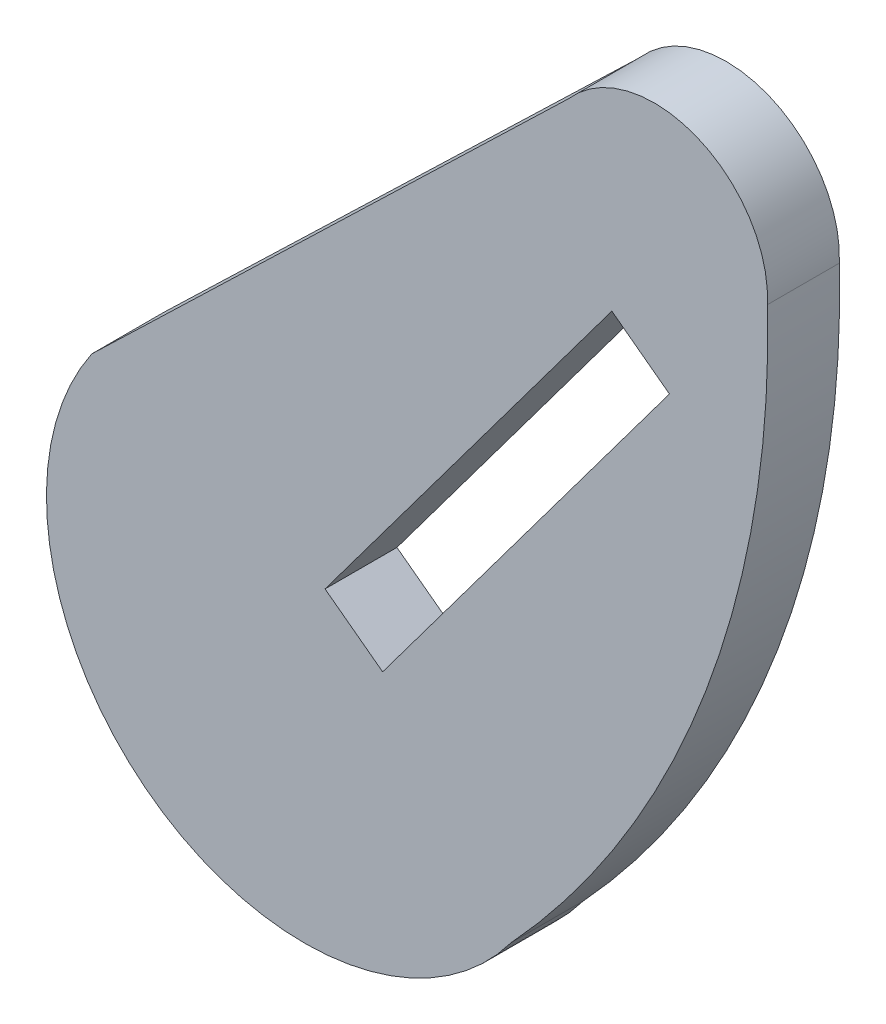
ISO-10303-21;
HEADER;
FILE_DESCRIPTION(('STEP AP214'),'2;1');
FILE_NAME('part.step','',(''),(''),'','','');
FILE_SCHEMA(('AUTOMOTIVE_DESIGN { 1 0 10303 214 1 1 1 1 }'));
ENDSEC;
DATA;
#1=APPLICATION_CONTEXT('core data for automotive mechanical design processes');
#2=APPLICATION_PROTOCOL_DEFINITION('international standard','automotive_design',2000,#1);
#3=PRODUCT_CONTEXT('',#1,'mechanical');
#4=PRODUCT('Part','Part','',(#3));
#5=PRODUCT_RELATED_PRODUCT_CATEGORY('part','',(#4));
#6=PRODUCT_DEFINITION_FORMATION('','',#4);
#7=PRODUCT_DEFINITION_CONTEXT('part definition',#1,'design');
#8=PRODUCT_DEFINITION('design','',#6,#7);
#9=PRODUCT_DEFINITION_SHAPE('','',#8);
#10=(LENGTH_UNIT() NAMED_UNIT(*) SI_UNIT(.MILLI.,.METRE.));
#11=(NAMED_UNIT(*) PLANE_ANGLE_UNIT() SI_UNIT($,.RADIAN.));
#12=(NAMED_UNIT(*) SI_UNIT($,.STERADIAN.) SOLID_ANGLE_UNIT());
#13=UNCERTAINTY_MEASURE_WITH_UNIT(LENGTH_MEASURE(1.E-05),#10,'distance_accuracy_value','');
#14=(GEOMETRIC_REPRESENTATION_CONTEXT(3) GLOBAL_UNCERTAINTY_ASSIGNED_CONTEXT((#13)) GLOBAL_UNIT_ASSIGNED_CONTEXT((#10,
#11,#12)) REPRESENTATION_CONTEXT('',''));
#15=CARTESIAN_POINT('',(0.,0.,0.));
#16=DIRECTION('',(0.,0.,1.));
#17=DIRECTION('',(1.,0.,0.));
#18=AXIS2_PLACEMENT_3D('',#15,#16,#17);
#19=CARTESIAN_POINT('',(-800.658033872501,-117.32718023379,3.));
#20=DIRECTION('',(0.,0.,1.));
#21=DIRECTION('',(1.,0.,0.));
#22=AXIS2_PLACEMENT_3D('',#19,#20,#21);
#23=PLANE('',#22);
#24=CARTESIAN_POINT('',(-800.658033872501,-117.32718023379,3.));
#25=DIRECTION('',(0.,0.,1.));
#26=DIRECTION('',(1.,0.,0.));
#27=AXIS2_PLACEMENT_3D('',#24,#25,#26);
#28=CIRCLE('',#27,10.7666614434912);
#29=CARTESIAN_POINT('',(-809.531671810658,-111.229676778992,3.));
#30=VERTEX_POINT('',#29);
#31=CARTESIAN_POINT('',(-792.031629072118,-123.769706047373,3.));
#32=VERTEX_POINT('',#31);
#33=EDGE_CURVE('E141',#30,#32,#28,.T.);
#34=ORIENTED_EDGE('',*,*,#33,.T.);
#35=CARTESIAN_POINT('',(-821.645619087199,-96.3880376426148,3.));
#36=DIRECTION('',(0.,0.,1.));
#37=DIRECTION('',(1.,0.,0.));
#38=AXIS2_PLACEMENT_3D('',#35,#36,#37);
#39=CIRCLE('',#38,40.3329166964334);
#40=CARTESIAN_POINT('',(-781.326120483584,-95.347748454672,3.));
#41=VERTEX_POINT('',#40);
#42=EDGE_CURVE('E144',#32,#41,#39,.T.);
#43=ORIENTED_EDGE('',*,*,#42,.T.);
#44=CARTESIAN_POINT('',(-786.047877368588,-95.1410879811995,3.));
#45=DIRECTION('',(0.,0.,1.));
#46=DIRECTION('',(1.,0.,0.));
#47=AXIS2_PLACEMENT_3D('',#44,#45,#46);
#48=CIRCLE('',#47,4.72627724878407);
#49=CARTESIAN_POINT('',(-789.614138010312,-92.0395590569968,3.));
#50=VERTEX_POINT('',#49);
#51=EDGE_CURVE('E146',#41,#50,#48,.T.);
#52=ORIENTED_EDGE('',*,*,#51,.T.);
#53=DIRECTION('',(-0.720134653279969,-0.693834332636645,0.));
#54=VECTOR('',#53,1.);
#55=CARTESIAN_POINT('',(-809.531671810658,-111.229676778992,3.));
#56=LINE('',#55,#54);
#57=EDGE_CURVE('E148',#50,#30,#56,.T.);
#58=ORIENTED_EDGE('',*,*,#57,.T.);
#59=EDGE_LOOP('',(#34,#43,#52,#58));
#60=FACE_BOUND('',#59,.T.);
#61=DIRECTION('',(0.598377300837112,0.801214456835929,0.));
#62=VECTOR('',#61,1.);
#63=CARTESIAN_POINT('',(-797.390770346987,-116.654380858265,3.));
#64=LINE('',#63,#62);
#65=CARTESIAN_POINT('',(-797.390770346987,-116.654380858265,3.));
#66=VERTEX_POINT('',#65);
#67=CARTESIAN_POINT('',(-785.418685199394,-100.624013922047,3.));
#68=VERTEX_POINT('',#67);
#69=EDGE_CURVE('E123',#66,#68,#64,.T.);
#70=ORIENTED_EDGE('',*,*,#69,.F.);
#71=DIRECTION('',(0.801214456835929,-0.598377300837112,0.));
#72=VECTOR('',#71,1.);
#73=CARTESIAN_POINT('',(-799.794413717495,-114.859248955753,3.));
#74=LINE('',#73,#72);
#75=CARTESIAN_POINT('',(-799.794413717495,-114.859248955753,3.));
#76=VERTEX_POINT('',#75);
#77=EDGE_CURVE('E112',#76,#66,#74,.T.);
#78=ORIENTED_EDGE('',*,*,#77,.F.);
#79=DIRECTION('',(-0.598377300837113,-0.801214456835928,0.));
#80=VECTOR('',#79,1.);
#81=CARTESIAN_POINT('',(-787.822328569902,-98.8288820195359,3.));
#82=LINE('',#81,#80);
#83=CARTESIAN_POINT('',(-787.822328569902,-98.8288820195359,3.));
#84=VERTEX_POINT('',#83);
#85=EDGE_CURVE('E127',#84,#76,#82,.T.);
#86=ORIENTED_EDGE('',*,*,#85,.F.);
#87=DIRECTION('',(-0.801214456835933,0.598377300837106,0.));
#88=VECTOR('',#87,1.);
#89=CARTESIAN_POINT('',(-785.418685199394,-100.624013922047,3.));
#90=LINE('',#89,#88);
#91=EDGE_CURVE('E125',#68,#84,#90,.T.);
#92=ORIENTED_EDGE('',*,*,#91,.F.);
#93=EDGE_LOOP('',(#70,#78,#86,#92));
#94=FACE_BOUND('',#93,.T.);
#95=ADVANCED_FACE('F32',(#60,#94),#23,.T.);
#96=CARTESIAN_POINT('',(-800.658033872501,-117.32718023379,0.));
#97=DIRECTION('',(0.,0.,1.));
#98=DIRECTION('',(1.,0.,0.));
#99=AXIS2_PLACEMENT_3D('',#96,#97,#98);
#100=PLANE('',#99);
#101=CARTESIAN_POINT('',(-800.658033872501,-117.32718023379,0.));
#102=DIRECTION('',(0.,0.,1.));
#103=DIRECTION('',(1.,0.,0.));
#104=AXIS2_PLACEMENT_3D('',#101,#102,#103);
#105=CIRCLE('',#104,10.7666614434912);
#106=CARTESIAN_POINT('',(-809.531671810658,-111.229676778992,0.));
#107=VERTEX_POINT('',#106);
#108=CARTESIAN_POINT('',(-792.031629072118,-123.769706047373,0.));
#109=VERTEX_POINT('',#108);
#110=EDGE_CURVE('E113',#107,#109,#105,.T.);
#111=ORIENTED_EDGE('',*,*,#110,.F.);
#112=DIRECTION('',(-0.720134653279969,-0.693834332636645,0.));
#113=VECTOR('',#112,1.);
#114=CARTESIAN_POINT('',(-809.531671810658,-111.229676778992,0.));
#115=LINE('',#114,#113);
#116=CARTESIAN_POINT('',(-789.614138010312,-92.0395590569968,0.));
#117=VERTEX_POINT('',#116);
#118=EDGE_CURVE('E139',#117,#107,#115,.T.);
#119=ORIENTED_EDGE('',*,*,#118,.F.);
#120=CARTESIAN_POINT('',(-786.047877368588,-95.1410879811995,0.));
#121=DIRECTION('',(0.,0.,1.));
#122=DIRECTION('',(1.,0.,0.));
#123=AXIS2_PLACEMENT_3D('',#120,#121,#122);
#124=CIRCLE('',#123,4.72627724878407);
#125=CARTESIAN_POINT('',(-781.326120483584,-95.347748454672,0.));
#126=VERTEX_POINT('',#125);
#127=EDGE_CURVE('E137',#126,#117,#124,.T.);
#128=ORIENTED_EDGE('',*,*,#127,.F.);
#129=CARTESIAN_POINT('',(-821.645619087199,-96.3880376426148,0.));
#130=DIRECTION('',(0.,0.,1.));
#131=DIRECTION('',(1.,0.,0.));
#132=AXIS2_PLACEMENT_3D('',#129,#130,#131);
#133=CIRCLE('',#132,40.3329166964334);
#134=EDGE_CURVE('E135',#109,#126,#133,.T.);
#135=ORIENTED_EDGE('',*,*,#134,.F.);
#136=EDGE_LOOP('',(#111,#119,#128,#135));
#137=FACE_BOUND('',#136,.T.);
#138=DIRECTION('',(0.801214456835929,-0.598377300837112,0.));
#139=VECTOR('',#138,1.);
#140=CARTESIAN_POINT('',(-799.794413717495,-114.859248955753,0.));
#141=LINE('',#140,#139);
#142=CARTESIAN_POINT('',(-799.794413717495,-114.859248955753,0.));
#143=VERTEX_POINT('',#142);
#144=CARTESIAN_POINT('',(-797.390770346987,-116.654380858265,0.));
#145=VERTEX_POINT('',#144);
#146=EDGE_CURVE('E55',#143,#145,#141,.T.);
#147=ORIENTED_EDGE('',*,*,#146,.T.);
#148=DIRECTION('',(0.598377300837112,0.801214456835929,0.));
#149=VECTOR('',#148,1.);
#150=CARTESIAN_POINT('',(-797.390770346987,-116.654380858265,0.));
#151=LINE('',#150,#149);
#152=CARTESIAN_POINT('',(-785.418685199394,-100.624013922047,0.));
#153=VERTEX_POINT('',#152);
#154=EDGE_CURVE('E99',#145,#153,#151,.T.);
#155=ORIENTED_EDGE('',*,*,#154,.T.);
#156=DIRECTION('',(-0.801214456835933,0.598377300837106,0.));
#157=VECTOR('',#156,1.);
#158=CARTESIAN_POINT('',(-785.418685199394,-100.624013922047,0.));
#159=LINE('',#158,#157);
#160=CARTESIAN_POINT('',(-787.822328569902,-98.8288820195359,0.));
#161=VERTEX_POINT('',#160);
#162=EDGE_CURVE('E108',#153,#161,#159,.T.);
#163=ORIENTED_EDGE('',*,*,#162,.T.);
#164=DIRECTION('',(-0.598377300837113,-0.801214456835928,0.));
#165=VECTOR('',#164,1.);
#166=CARTESIAN_POINT('',(-787.822328569902,-98.8288820195359,0.));
#167=LINE('',#166,#165);
#168=EDGE_CURVE('E117',#161,#143,#167,.T.);
#169=ORIENTED_EDGE('',*,*,#168,.T.);
#170=EDGE_LOOP('',(#147,#155,#163,#169));
#171=FACE_BOUND('',#170,.T.);
#172=ADVANCED_FACE('F116',(#137,#171),#100,.F.);
#173=CARTESIAN_POINT('',(-800.658033872501,-117.32718023379,3.));
#174=DIRECTION('',(0.,0.,-1.));
#175=DIRECTION('',(-1.,0.,0.));
#176=AXIS2_PLACEMENT_3D('',#173,#174,#175);
#177=CYLINDRICAL_SURFACE('',#176,10.7666614434912);
#178=ORIENTED_EDGE('',*,*,#110,.T.);
#179=DIRECTION('',(0.,0.,-1.));
#180=VECTOR('',#179,1.);
#181=CARTESIAN_POINT('',(-792.031629072118,-123.769706047373,3.));
#182=LINE('',#181,#180);
#183=EDGE_CURVE('E11',#32,#109,#182,.T.);
#184=ORIENTED_EDGE('',*,*,#183,.F.);
#185=ORIENTED_EDGE('',*,*,#33,.F.);
#186=DIRECTION('',(0.,0.,-1.));
#187=VECTOR('',#186,1.);
#188=CARTESIAN_POINT('',(-809.531671810658,-111.229676778992,3.));
#189=LINE('',#188,#187);
#190=EDGE_CURVE('E150',#30,#107,#189,.T.);
#191=ORIENTED_EDGE('',*,*,#190,.T.);
#192=EDGE_LOOP('',(#178,#184,#185,#191));
#193=FACE_BOUND('',#192,.T.);
#194=ADVANCED_FACE('F34',(#193),#177,.T.);
#195=CARTESIAN_POINT('',(-821.645619087199,-96.3880376426148,3.));
#196=DIRECTION('',(0.,0.,-1.));
#197=DIRECTION('',(-1.,0.,0.));
#198=AXIS2_PLACEMENT_3D('',#195,#196,#197);
#199=CYLINDRICAL_SURFACE('',#198,40.3329166964334);
#200=ORIENTED_EDGE('',*,*,#134,.T.);
#201=DIRECTION('',(0.,0.,-1.));
#202=VECTOR('',#201,1.);
#203=CARTESIAN_POINT('',(-781.326120483584,-95.347748454672,3.));
#204=LINE('',#203,#202);
#205=EDGE_CURVE('E40',#41,#126,#204,.T.);
#206=ORIENTED_EDGE('',*,*,#205,.F.);
#207=ORIENTED_EDGE('',*,*,#42,.F.);
#208=ORIENTED_EDGE('',*,*,#183,.T.);
#209=EDGE_LOOP('',(#200,#206,#207,#208));
#210=FACE_BOUND('',#209,.T.);
#211=ADVANCED_FACE('F175',(#210),#199,.T.);
#212=CARTESIAN_POINT('',(-786.047877368588,-95.1410879811995,3.));
#213=DIRECTION('',(0.,0.,-1.));
#214=DIRECTION('',(-1.,0.,0.));
#215=AXIS2_PLACEMENT_3D('',#212,#213,#214);
#216=CYLINDRICAL_SURFACE('',#215,4.72627724878407);
#217=ORIENTED_EDGE('',*,*,#127,.T.);
#218=DIRECTION('',(0.,0.,-1.));
#219=VECTOR('',#218,1.);
#220=CARTESIAN_POINT('',(-789.614138010312,-92.0395590569968,3.));
#221=LINE('',#220,#219);
#222=EDGE_CURVE('E153',#50,#117,#221,.T.);
#223=ORIENTED_EDGE('',*,*,#222,.F.);
#224=ORIENTED_EDGE('',*,*,#51,.F.);
#225=ORIENTED_EDGE('',*,*,#205,.T.);
#226=EDGE_LOOP('',(#217,#223,#224,#225));
#227=FACE_BOUND('',#226,.T.);
#228=ADVANCED_FACE('F160',(#227),#216,.T.);
#229=CARTESIAN_POINT('',(-809.531671810658,-111.229676778992,3.));
#230=DIRECTION('',(0.693834332636645,-0.720134653279969,0.));
#231=DIRECTION('',(0.720134653279969,0.693834332636646,0.));
#232=AXIS2_PLACEMENT_3D('',#229,#230,#231);
#233=PLANE('',#232);
#234=ORIENTED_EDGE('',*,*,#118,.T.);
#235=ORIENTED_EDGE('',*,*,#190,.F.);
#236=ORIENTED_EDGE('',*,*,#57,.F.);
#237=ORIENTED_EDGE('',*,*,#222,.T.);
#238=EDGE_LOOP('',(#234,#235,#236,#237));
#239=FACE_BOUND('',#238,.T.);
#240=ADVANCED_FACE('F168',(#239),#233,.F.);
#241=CARTESIAN_POINT('',(-799.794413717495,-114.859248955753,3.));
#242=DIRECTION('',(0.598377300837112,0.801214456835929,0.));
#243=DIRECTION('',(-0.801214456835929,0.598377300837112,0.));
#244=AXIS2_PLACEMENT_3D('',#241,#242,#243);
#245=PLANE('',#244);
#246=ORIENTED_EDGE('',*,*,#146,.F.);
#247=DIRECTION('',(0.,0.,-1.));
#248=VECTOR('',#247,1.);
#249=CARTESIAN_POINT('',(-799.794413717495,-114.859248955753,3.));
#250=LINE('',#249,#248);
#251=EDGE_CURVE('E129',#76,#143,#250,.T.);
#252=ORIENTED_EDGE('',*,*,#251,.F.);
#253=ORIENTED_EDGE('',*,*,#77,.T.);
#254=DIRECTION('',(0.,0.,-1.));
#255=VECTOR('',#254,1.);
#256=CARTESIAN_POINT('',(-797.390770346987,-116.654380858265,3.));
#257=LINE('',#256,#255);
#258=EDGE_CURVE('E101',#66,#145,#257,.T.);
#259=ORIENTED_EDGE('',*,*,#258,.T.);
#260=EDGE_LOOP('',(#246,#252,#253,#259));
#261=FACE_BOUND('',#260,.T.);
#262=ADVANCED_FACE('F110',(#261),#245,.T.);
#263=CARTESIAN_POINT('',(-797.390770346987,-116.654380858265,3.));
#264=DIRECTION('',(-0.801214456835928,0.598377300837112,0.));
#265=DIRECTION('',(-0.598377300837112,-0.801214456835929,0.));
#266=AXIS2_PLACEMENT_3D('',#263,#264,#265);
#267=PLANE('',#266);
#268=ORIENTED_EDGE('',*,*,#154,.F.);
#269=ORIENTED_EDGE('',*,*,#258,.F.);
#270=ORIENTED_EDGE('',*,*,#69,.T.);
#271=DIRECTION('',(0.,0.,-1.));
#272=VECTOR('',#271,1.);
#273=CARTESIAN_POINT('',(-785.418685199394,-100.624013922047,3.));
#274=LINE('',#273,#272);
#275=EDGE_CURVE('E104',#68,#153,#274,.T.);
#276=ORIENTED_EDGE('',*,*,#275,.T.);
#277=EDGE_LOOP('',(#268,#269,#270,#276));
#278=FACE_BOUND('',#277,.T.);
#279=ADVANCED_FACE('F100',(#278),#267,.T.);
#280=CARTESIAN_POINT('',(-785.418685199394,-100.624013922047,3.));
#281=DIRECTION('',(-0.598377300837106,-0.801214456835933,0.));
#282=DIRECTION('',(0.801214456835933,-0.598377300837106,0.));
#283=AXIS2_PLACEMENT_3D('',#280,#281,#282);
#284=PLANE('',#283);
#285=ORIENTED_EDGE('',*,*,#162,.F.);
#286=ORIENTED_EDGE('',*,*,#275,.F.);
#287=ORIENTED_EDGE('',*,*,#91,.T.);
#288=DIRECTION('',(0.,0.,-1.));
#289=VECTOR('',#288,1.);
#290=CARTESIAN_POINT('',(-787.822328569902,-98.8288820195359,3.));
#291=LINE('',#290,#289);
#292=EDGE_CURVE('E47',#84,#161,#291,.T.);
#293=ORIENTED_EDGE('',*,*,#292,.T.);
#294=EDGE_LOOP('',(#285,#286,#287,#293));
#295=FACE_BOUND('',#294,.T.);
#296=ADVANCED_FACE('F197',(#295),#284,.T.);
#297=CARTESIAN_POINT('',(-787.822328569902,-98.8288820195359,3.));
#298=DIRECTION('',(0.801214456835928,-0.598377300837113,0.));
#299=DIRECTION('',(0.598377300837113,0.801214456835928,0.));
#300=AXIS2_PLACEMENT_3D('',#297,#298,#299);
#301=PLANE('',#300);
#302=ORIENTED_EDGE('',*,*,#168,.F.);
#303=ORIENTED_EDGE('',*,*,#292,.F.);
#304=ORIENTED_EDGE('',*,*,#85,.T.);
#305=ORIENTED_EDGE('',*,*,#251,.T.);
#306=EDGE_LOOP('',(#302,#303,#304,#305));
#307=FACE_BOUND('',#306,.T.);
#308=ADVANCED_FACE('F202',(#307),#301,.T.);
#309=CLOSED_SHELL('',(#95,#172,#194,#211,#228,#240,#262,#279,#296,#308));
#310=MANIFOLD_SOLID_BREP('B2',#309);
#311=ADVANCED_BREP_SHAPE_REPRESENTATION('',(#18,#310),#14);
#312=SHAPE_DEFINITION_REPRESENTATION(#9,#311);
ENDSEC;
END-ISO-10303-21;
